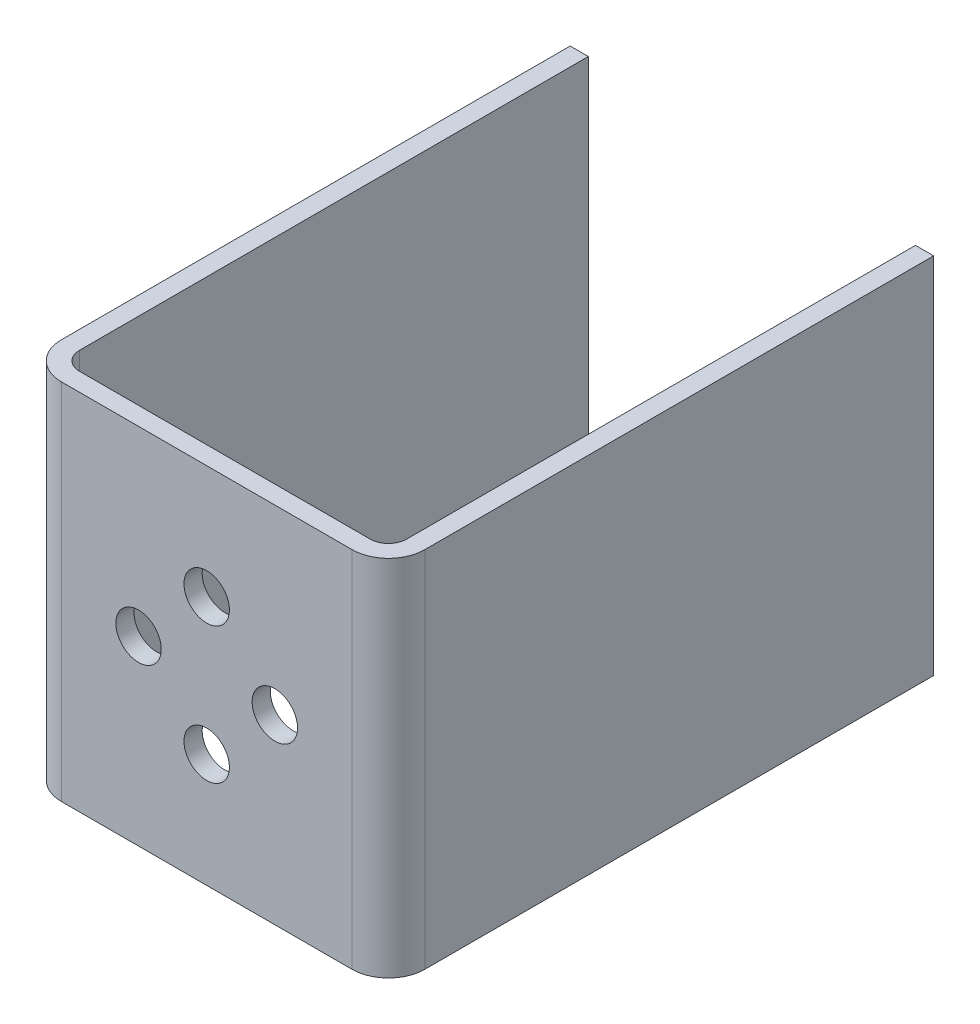
ISO-10303-21;
HEADER;
FILE_DESCRIPTION(('STEP AP214'),'2;1');
FILE_NAME('part.step','',(''),(''),'','','');
FILE_SCHEMA(('AUTOMOTIVE_DESIGN { 1 0 10303 214 1 1 1 1 }'));
ENDSEC;
DATA;
#1=APPLICATION_CONTEXT('core data for automotive mechanical design processes');
#2=APPLICATION_PROTOCOL_DEFINITION('international standard','automotive_design',2000,#1);
#3=PRODUCT_CONTEXT('',#1,'mechanical');
#4=PRODUCT('Part','Part','',(#3));
#5=PRODUCT_RELATED_PRODUCT_CATEGORY('part','',(#4));
#6=PRODUCT_DEFINITION_FORMATION('','',#4);
#7=PRODUCT_DEFINITION_CONTEXT('part definition',#1,'design');
#8=PRODUCT_DEFINITION('design','',#6,#7);
#9=PRODUCT_DEFINITION_SHAPE('','',#8);
#10=(LENGTH_UNIT() NAMED_UNIT(*) SI_UNIT(.MILLI.,.METRE.));
#11=(NAMED_UNIT(*) PLANE_ANGLE_UNIT() SI_UNIT($,.RADIAN.));
#12=(NAMED_UNIT(*) SI_UNIT($,.STERADIAN.) SOLID_ANGLE_UNIT());
#13=UNCERTAINTY_MEASURE_WITH_UNIT(LENGTH_MEASURE(1.E-05),#10,'distance_accuracy_value','');
#14=(GEOMETRIC_REPRESENTATION_CONTEXT(3) GLOBAL_UNCERTAINTY_ASSIGNED_CONTEXT((#13)) GLOBAL_UNIT_ASSIGNED_CONTEXT((#10,
#11,#12)) REPRESENTATION_CONTEXT('',''));
#15=CARTESIAN_POINT('',(0.,0.,0.));
#16=DIRECTION('',(0.,0.,1.));
#17=DIRECTION('',(1.,0.,0.));
#18=AXIS2_PLACEMENT_3D('',#15,#16,#17);
#19=CARTESIAN_POINT('',(48.26,50.8,-76.2));
#20=DIRECTION('',(0.,0.,1.));
#21=DIRECTION('',(1.,0.,0.));
#22=AXIS2_PLACEMENT_3D('',#19,#20,#21);
#23=PLANE('',#22);
#24=DIRECTION('',(-1.,0.,0.));
#25=VECTOR('',#24,1.);
#26=CARTESIAN_POINT('',(48.26,0.,-76.2));
#27=LINE('',#26,#25);
#28=CARTESIAN_POINT('',(50.8,0.,-76.2));
#29=VERTEX_POINT('',#28);
#30=CARTESIAN_POINT('',(48.26,0.,-76.2));
#31=VERTEX_POINT('',#30);
#32=EDGE_CURVE('E161',#29,#31,#27,.T.);
#33=ORIENTED_EDGE('',*,*,#32,.T.);
#34=DIRECTION('',(0.,-1.,0.));
#35=VECTOR('',#34,1.);
#36=CARTESIAN_POINT('',(48.26,50.8,-76.2));
#37=LINE('',#36,#35);
#38=CARTESIAN_POINT('',(48.26,50.8,-76.2));
#39=VERTEX_POINT('',#38);
#40=EDGE_CURVE('E11',#39,#31,#37,.T.);
#41=ORIENTED_EDGE('',*,*,#40,.F.);
#42=DIRECTION('',(-1.,0.,0.));
#43=VECTOR('',#42,1.);
#44=CARTESIAN_POINT('',(48.26,50.8,-76.2));
#45=LINE('',#44,#43);
#46=CARTESIAN_POINT('',(50.8,50.8,-76.2));
#47=VERTEX_POINT('',#46);
#48=EDGE_CURVE('E184',#47,#39,#45,.T.);
#49=ORIENTED_EDGE('',*,*,#48,.F.);
#50=DIRECTION('',(0.,-1.,0.));
#51=VECTOR('',#50,1.);
#52=CARTESIAN_POINT('',(50.8,50.8,-76.2));
#53=LINE('',#52,#51);
#54=EDGE_CURVE('E157',#47,#29,#53,.T.);
#55=ORIENTED_EDGE('',*,*,#54,.T.);
#56=EDGE_LOOP('',(#33,#41,#49,#55));
#57=FACE_BOUND('',#56,.T.);
#58=ADVANCED_FACE('F41',(#57),#23,.F.);
#59=CARTESIAN_POINT('',(48.26,50.8,-5.08));
#60=DIRECTION('',(1.,0.,0.));
#61=DIRECTION('',(0.,0.,-1.));
#62=AXIS2_PLACEMENT_3D('',#59,#60,#61);
#63=PLANE('',#62);
#64=DIRECTION('',(0.,0.,1.));
#65=VECTOR('',#64,1.);
#66=CARTESIAN_POINT('',(48.26,0.,-5.08));
#67=LINE('',#66,#65);
#68=CARTESIAN_POINT('',(48.26,0.,-5.08));
#69=VERTEX_POINT('',#68);
#70=EDGE_CURVE('E164',#31,#69,#67,.T.);
#71=ORIENTED_EDGE('',*,*,#70,.T.);
#72=DIRECTION('',(0.,-1.,0.));
#73=VECTOR('',#72,1.);
#74=CARTESIAN_POINT('',(48.26,50.8,-5.08));
#75=LINE('',#74,#73);
#76=CARTESIAN_POINT('',(48.26,50.8,-5.08));
#77=VERTEX_POINT('',#76);
#78=EDGE_CURVE('E49',#77,#69,#75,.T.);
#79=ORIENTED_EDGE('',*,*,#78,.F.);
#80=DIRECTION('',(0.,0.,1.));
#81=VECTOR('',#80,1.);
#82=CARTESIAN_POINT('',(48.26,50.8,-5.08));
#83=LINE('',#82,#81);
#84=EDGE_CURVE('E112',#39,#77,#83,.T.);
#85=ORIENTED_EDGE('',*,*,#84,.F.);
#86=ORIENTED_EDGE('',*,*,#40,.T.);
#87=EDGE_LOOP('',(#71,#79,#85,#86));
#88=FACE_BOUND('',#87,.T.);
#89=ADVANCED_FACE('F262',(#88),#63,.F.);
#90=CARTESIAN_POINT('',(45.72,50.8,-5.08));
#91=DIRECTION('',(0.,-1.,0.));
#92=DIRECTION('',(0.,0.,-1.));
#93=AXIS2_PLACEMENT_3D('',#90,#91,#92);
#94=CYLINDRICAL_SURFACE('',#93,2.54);
#95=CARTESIAN_POINT('',(45.72,0.,-5.08));
#96=DIRECTION('',(0.,-1.,0.));
#97=DIRECTION('',(0.,0.,1.));
#98=AXIS2_PLACEMENT_3D('',#95,#96,#97);
#99=CIRCLE('',#98,2.54);
#100=CARTESIAN_POINT('',(45.72,0.,-2.54));
#101=VERTEX_POINT('',#100);
#102=EDGE_CURVE('E167',#69,#101,#99,.T.);
#103=ORIENTED_EDGE('',*,*,#102,.T.);
#104=DIRECTION('',(0.,-1.,0.));
#105=VECTOR('',#104,1.);
#106=CARTESIAN_POINT('',(45.72,50.8,-2.54));
#107=LINE('',#106,#105);
#108=CARTESIAN_POINT('',(45.72,50.8,-2.54));
#109=VERTEX_POINT('',#108);
#110=EDGE_CURVE('E203',#109,#101,#107,.T.);
#111=ORIENTED_EDGE('',*,*,#110,.F.);
#112=CARTESIAN_POINT('',(45.72,50.8,-5.08));
#113=DIRECTION('',(0.,-1.,0.));
#114=DIRECTION('',(0.,0.,1.));
#115=AXIS2_PLACEMENT_3D('',#112,#113,#114);
#116=CIRCLE('',#115,2.54);
#117=EDGE_CURVE('E211',#77,#109,#116,.T.);
#118=ORIENTED_EDGE('',*,*,#117,.F.);
#119=ORIENTED_EDGE('',*,*,#78,.T.);
#120=EDGE_LOOP('',(#103,#111,#118,#119));
#121=FACE_BOUND('',#120,.T.);
#122=ADVANCED_FACE('F209',(#121),#94,.F.);
#123=CARTESIAN_POINT('',(5.08000000000001,50.8,-2.54));
#124=DIRECTION('',(0.,0.,1.));
#125=DIRECTION('',(1.,0.,0.));
#126=AXIS2_PLACEMENT_3D('',#123,#124,#125);
#127=PLANE('',#126);
#128=CARTESIAN_POINT('',(34.925,25.4,-2.54));
#129=DIRECTION('',(0.,0.,-1.));
#130=DIRECTION('',(-1.,0.,0.));
#131=AXIS2_PLACEMENT_3D('',#128,#129,#130);
#132=CIRCLE('',#131,3.175);
#133=CARTESIAN_POINT('',(31.75,25.4,-2.54));
#134=VERTEX_POINT('',#133);
#135=EDGE_CURVE('E322',#134,#134,#132,.T.);
#136=ORIENTED_EDGE('',*,*,#135,.F.);
#137=EDGE_LOOP('',(#136));
#138=FACE_BOUND('',#137,.T.);
#139=CARTESIAN_POINT('',(25.4,34.925,-2.54));
#140=DIRECTION('',(0.,0.,-1.));
#141=DIRECTION('',(-1.,0.,0.));
#142=AXIS2_PLACEMENT_3D('',#139,#140,#141);
#143=CIRCLE('',#142,3.17499999999999);
#144=CARTESIAN_POINT('',(22.225,34.925,-2.54));
#145=VERTEX_POINT('',#144);
#146=EDGE_CURVE('E319',#145,#145,#143,.T.);
#147=ORIENTED_EDGE('',*,*,#146,.F.);
#148=EDGE_LOOP('',(#147));
#149=FACE_BOUND('',#148,.T.);
#150=CARTESIAN_POINT('',(15.875,25.4,-2.54));
#151=DIRECTION('',(0.,0.,-1.));
#152=DIRECTION('',(-1.,0.,0.));
#153=AXIS2_PLACEMENT_3D('',#150,#151,#152);
#154=CIRCLE('',#153,3.17499999999999);
#155=CARTESIAN_POINT('',(12.7,25.4,-2.54));
#156=VERTEX_POINT('',#155);
#157=EDGE_CURVE('E315',#156,#156,#154,.T.);
#158=ORIENTED_EDGE('',*,*,#157,.F.);
#159=EDGE_LOOP('',(#158));
#160=FACE_BOUND('',#159,.T.);
#161=CARTESIAN_POINT('',(25.4,15.875,-2.54));
#162=DIRECTION('',(0.,0.,-1.));
#163=DIRECTION('',(-1.,0.,0.));
#164=AXIS2_PLACEMENT_3D('',#161,#162,#163);
#165=CIRCLE('',#164,3.175);
#166=CARTESIAN_POINT('',(22.225,15.875,-2.54));
#167=VERTEX_POINT('',#166);
#168=EDGE_CURVE('E307',#167,#167,#165,.T.);
#169=ORIENTED_EDGE('',*,*,#168,.F.);
#170=EDGE_LOOP('',(#169));
#171=FACE_BOUND('',#170,.T.);
#172=DIRECTION('',(-1.,0.,0.));
#173=VECTOR('',#172,1.);
#174=CARTESIAN_POINT('',(5.08000000000001,0.,-2.54));
#175=LINE('',#174,#173);
#176=CARTESIAN_POINT('',(5.08000000000001,0.,-2.54));
#177=VERTEX_POINT('',#176);
#178=EDGE_CURVE('E169',#101,#177,#175,.T.);
#179=ORIENTED_EDGE('',*,*,#178,.T.);
#180=DIRECTION('',(0.,-1.,0.));
#181=VECTOR('',#180,1.);
#182=CARTESIAN_POINT('',(5.08000000000001,50.8,-2.54));
#183=LINE('',#182,#181);
#184=CARTESIAN_POINT('',(5.08000000000001,50.8,-2.54));
#185=VERTEX_POINT('',#184);
#186=EDGE_CURVE('E200',#185,#177,#183,.T.);
#187=ORIENTED_EDGE('',*,*,#186,.F.);
#188=DIRECTION('',(-1.,0.,0.));
#189=VECTOR('',#188,1.);
#190=CARTESIAN_POINT('',(5.08000000000001,50.8,-2.54));
#191=LINE('',#190,#189);
#192=EDGE_CURVE('E229',#109,#185,#191,.T.);
#193=ORIENTED_EDGE('',*,*,#192,.F.);
#194=ORIENTED_EDGE('',*,*,#110,.T.);
#195=EDGE_LOOP('',(#179,#187,#193,#194));
#196=FACE_BOUND('',#195,.T.);
#197=ADVANCED_FACE('F220',(#138,#149,#160,#171,#196),#127,.F.);
#198=CARTESIAN_POINT('',(5.08000000000001,50.8,-5.08));
#199=DIRECTION('',(0.,-1.,0.));
#200=DIRECTION('',(0.,0.,-1.));
#201=AXIS2_PLACEMENT_3D('',#198,#199,#200);
#202=CYLINDRICAL_SURFACE('',#201,2.54);
#203=CARTESIAN_POINT('',(5.08000000000001,0.,-5.08));
#204=DIRECTION('',(0.,-1.,0.));
#205=DIRECTION('',(0.,0.,1.));
#206=AXIS2_PLACEMENT_3D('',#203,#204,#205);
#207=CIRCLE('',#206,2.54);
#208=CARTESIAN_POINT('',(2.54000000000001,0.,-5.08));
#209=VERTEX_POINT('',#208);
#210=EDGE_CURVE('E171',#177,#209,#207,.T.);
#211=ORIENTED_EDGE('',*,*,#210,.T.);
#212=DIRECTION('',(0.,-1.,0.));
#213=VECTOR('',#212,1.);
#214=CARTESIAN_POINT('',(2.54000000000001,50.8,-5.08));
#215=LINE('',#214,#213);
#216=CARTESIAN_POINT('',(2.54000000000001,50.8,-5.08));
#217=VERTEX_POINT('',#216);
#218=EDGE_CURVE('E197',#217,#209,#215,.T.);
#219=ORIENTED_EDGE('',*,*,#218,.F.);
#220=CARTESIAN_POINT('',(5.08000000000001,50.8,-5.08));
#221=DIRECTION('',(0.,-1.,0.));
#222=DIRECTION('',(0.,0.,1.));
#223=AXIS2_PLACEMENT_3D('',#220,#221,#222);
#224=CIRCLE('',#223,2.54);
#225=EDGE_CURVE('E226',#185,#217,#224,.T.);
#226=ORIENTED_EDGE('',*,*,#225,.F.);
#227=ORIENTED_EDGE('',*,*,#186,.T.);
#228=EDGE_LOOP('',(#211,#219,#226,#227));
#229=FACE_BOUND('',#228,.T.);
#230=ADVANCED_FACE('F224',(#229),#202,.F.);
#231=CARTESIAN_POINT('',(2.54,50.8,-76.2));
#232=DIRECTION('',(-1.,0.,0.));
#233=DIRECTION('',(0.,0.,1.));
#234=AXIS2_PLACEMENT_3D('',#231,#232,#233);
#235=PLANE('',#234);
#236=DIRECTION('',(0.,0.,-1.));
#237=VECTOR('',#236,1.);
#238=CARTESIAN_POINT('',(2.54,0.,-76.2));
#239=LINE('',#238,#237);
#240=CARTESIAN_POINT('',(2.54,0.,-76.2));
#241=VERTEX_POINT('',#240);
#242=EDGE_CURVE('E173',#209,#241,#239,.T.);
#243=ORIENTED_EDGE('',*,*,#242,.T.);
#244=DIRECTION('',(0.,-1.,0.));
#245=VECTOR('',#244,1.);
#246=CARTESIAN_POINT('',(2.54,50.8,-76.2));
#247=LINE('',#246,#245);
#248=CARTESIAN_POINT('',(2.54,50.8,-76.2));
#249=VERTEX_POINT('',#248);
#250=EDGE_CURVE('E194',#249,#241,#247,.T.);
#251=ORIENTED_EDGE('',*,*,#250,.F.);
#252=DIRECTION('',(0.,0.,-1.));
#253=VECTOR('',#252,1.);
#254=CARTESIAN_POINT('',(2.54,50.8,-76.2));
#255=LINE('',#254,#253);
#256=EDGE_CURVE('E228',#217,#249,#255,.T.);
#257=ORIENTED_EDGE('',*,*,#256,.F.);
#258=ORIENTED_EDGE('',*,*,#218,.T.);
#259=EDGE_LOOP('',(#243,#251,#257,#258));
#260=FACE_BOUND('',#259,.T.);
#261=ADVANCED_FACE('F276',(#260),#235,.F.);
#262=CARTESIAN_POINT('',(0.,50.8,-76.2));
#263=DIRECTION('',(0.,0.,1.));
#264=DIRECTION('',(1.,0.,0.));
#265=AXIS2_PLACEMENT_3D('',#262,#263,#264);
#266=PLANE('',#265);
#267=DIRECTION('',(-1.,0.,0.));
#268=VECTOR('',#267,1.);
#269=CARTESIAN_POINT('',(0.,0.,-76.2));
#270=LINE('',#269,#268);
#271=CARTESIAN_POINT('',(0.,0.,-76.2));
#272=VERTEX_POINT('',#271);
#273=EDGE_CURVE('E175',#241,#272,#270,.T.);
#274=ORIENTED_EDGE('',*,*,#273,.T.);
#275=DIRECTION('',(0.,-1.,0.));
#276=VECTOR('',#275,1.);
#277=CARTESIAN_POINT('',(0.,50.8,-76.2));
#278=LINE('',#277,#276);
#279=CARTESIAN_POINT('',(0.,50.8,-76.2));
#280=VERTEX_POINT('',#279);
#281=EDGE_CURVE('E191',#280,#272,#278,.T.);
#282=ORIENTED_EDGE('',*,*,#281,.F.);
#283=DIRECTION('',(-1.,0.,0.));
#284=VECTOR('',#283,1.);
#285=CARTESIAN_POINT('',(0.,50.8,-76.2));
#286=LINE('',#285,#284);
#287=EDGE_CURVE('E231',#249,#280,#286,.T.);
#288=ORIENTED_EDGE('',*,*,#287,.F.);
#289=ORIENTED_EDGE('',*,*,#250,.T.);
#290=EDGE_LOOP('',(#274,#282,#288,#289));
#291=FACE_BOUND('',#290,.T.);
#292=ADVANCED_FACE('F279',(#291),#266,.F.);
#293=CARTESIAN_POINT('',(0.,50.8,-5.08000000000004));
#294=DIRECTION('',(1.,0.,0.));
#295=DIRECTION('',(0.,0.,-1.));
#296=AXIS2_PLACEMENT_3D('',#293,#294,#295);
#297=PLANE('',#296);
#298=DIRECTION('',(0.,0.,1.));
#299=VECTOR('',#298,1.);
#300=CARTESIAN_POINT('',(0.,0.,-5.08000000000004));
#301=LINE('',#300,#299);
#302=CARTESIAN_POINT('',(0.,0.,-5.08000000000003));
#303=VERTEX_POINT('',#302);
#304=EDGE_CURVE('E177',#272,#303,#301,.T.);
#305=ORIENTED_EDGE('',*,*,#304,.T.);
#306=DIRECTION('',(0.,-1.,0.));
#307=VECTOR('',#306,1.);
#308=CARTESIAN_POINT('',(0.,50.8,-5.08000000000003));
#309=LINE('',#308,#307);
#310=CARTESIAN_POINT('',(0.,50.8,-5.08000000000003));
#311=VERTEX_POINT('',#310);
#312=EDGE_CURVE('E188',#311,#303,#309,.T.);
#313=ORIENTED_EDGE('',*,*,#312,.F.);
#314=DIRECTION('',(0.,0.,1.));
#315=VECTOR('',#314,1.);
#316=CARTESIAN_POINT('',(0.,50.8,-5.08000000000004));
#317=LINE('',#316,#315);
#318=EDGE_CURVE('E237',#280,#311,#317,.T.);
#319=ORIENTED_EDGE('',*,*,#318,.F.);
#320=ORIENTED_EDGE('',*,*,#281,.T.);
#321=EDGE_LOOP('',(#305,#313,#319,#320));
#322=FACE_BOUND('',#321,.T.);
#323=ADVANCED_FACE('F243',(#322),#297,.F.);
#324=CARTESIAN_POINT('',(5.08,50.8,-5.08));
#325=DIRECTION('',(0.,-1.,0.));
#326=DIRECTION('',(0.,0.,-1.));
#327=AXIS2_PLACEMENT_3D('',#324,#325,#326);
#328=CYLINDRICAL_SURFACE('',#327,5.08);
#329=CARTESIAN_POINT('',(5.08,0.,-5.08));
#330=DIRECTION('',(0.,1.,0.));
#331=DIRECTION('',(0.,0.,-1.));
#332=AXIS2_PLACEMENT_3D('',#329,#330,#331);
#333=CIRCLE('',#332,5.08);
#334=CARTESIAN_POINT('',(5.08000000000004,0.,0.));
#335=VERTEX_POINT('',#334);
#336=EDGE_CURVE('E179',#303,#335,#333,.T.);
#337=ORIENTED_EDGE('',*,*,#336,.T.);
#338=DIRECTION('',(0.,-1.,0.));
#339=VECTOR('',#338,1.);
#340=CARTESIAN_POINT('',(5.08000000000004,50.8,0.));
#341=LINE('',#340,#339);
#342=CARTESIAN_POINT('',(5.08000000000004,50.8,0.));
#343=VERTEX_POINT('',#342);
#344=EDGE_CURVE('E152',#343,#335,#341,.T.);
#345=ORIENTED_EDGE('',*,*,#344,.F.);
#346=CARTESIAN_POINT('',(5.08,50.8,-5.08));
#347=DIRECTION('',(0.,1.,0.));
#348=DIRECTION('',(0.,0.,-1.));
#349=AXIS2_PLACEMENT_3D('',#346,#347,#348);
#350=CIRCLE('',#349,5.08);
#351=EDGE_CURVE('E143',#311,#343,#350,.T.);
#352=ORIENTED_EDGE('',*,*,#351,.F.);
#353=ORIENTED_EDGE('',*,*,#312,.T.);
#354=EDGE_LOOP('',(#337,#345,#352,#353));
#355=FACE_BOUND('',#354,.T.);
#356=ADVANCED_FACE('F247',(#355),#328,.T.);
#357=CARTESIAN_POINT('',(5.08000000000004,50.8,0.));
#358=DIRECTION('',(0.,0.,-1.));
#359=DIRECTION('',(-1.,0.,0.));
#360=AXIS2_PLACEMENT_3D('',#357,#358,#359);
#361=PLANE('',#360);
#362=CARTESIAN_POINT('',(34.925,25.4,0.));
#363=DIRECTION('',(0.,0.,-1.));
#364=DIRECTION('',(-1.,0.,0.));
#365=AXIS2_PLACEMENT_3D('',#362,#363,#364);
#366=CIRCLE('',#365,3.175);
#367=CARTESIAN_POINT('',(31.75,25.4,0.));
#368=VERTEX_POINT('',#367);
#369=EDGE_CURVE('E165',#368,#368,#366,.T.);
#370=ORIENTED_EDGE('',*,*,#369,.T.);
#371=EDGE_LOOP('',(#370));
#372=FACE_BOUND('',#371,.T.);
#373=CARTESIAN_POINT('',(25.4,34.925,0.));
#374=DIRECTION('',(0.,0.,-1.));
#375=DIRECTION('',(-1.,0.,0.));
#376=AXIS2_PLACEMENT_3D('',#373,#374,#375);
#377=CIRCLE('',#376,3.17499999999999);
#378=CARTESIAN_POINT('',(22.225,34.925,0.));
#379=VERTEX_POINT('',#378);
#380=EDGE_CURVE('E298',#379,#379,#377,.T.);
#381=ORIENTED_EDGE('',*,*,#380,.T.);
#382=EDGE_LOOP('',(#381));
#383=FACE_BOUND('',#382,.T.);
#384=CARTESIAN_POINT('',(15.875,25.4,0.));
#385=DIRECTION('',(0.,0.,-1.));
#386=DIRECTION('',(-1.,0.,0.));
#387=AXIS2_PLACEMENT_3D('',#384,#385,#386);
#388=CIRCLE('',#387,3.17499999999999);
#389=CARTESIAN_POINT('',(12.7,25.4,0.));
#390=VERTEX_POINT('',#389);
#391=EDGE_CURVE('E302',#390,#390,#388,.T.);
#392=ORIENTED_EDGE('',*,*,#391,.T.);
#393=EDGE_LOOP('',(#392));
#394=FACE_BOUND('',#393,.T.);
#395=CARTESIAN_POINT('',(25.4,15.875,0.));
#396=DIRECTION('',(0.,0.,-1.));
#397=DIRECTION('',(-1.,0.,0.));
#398=AXIS2_PLACEMENT_3D('',#395,#396,#397);
#399=CIRCLE('',#398,3.175);
#400=CARTESIAN_POINT('',(22.225,15.875,0.));
#401=VERTEX_POINT('',#400);
#402=EDGE_CURVE('E305',#401,#401,#399,.T.);
#403=ORIENTED_EDGE('',*,*,#402,.T.);
#404=EDGE_LOOP('',(#403));
#405=FACE_BOUND('',#404,.T.);
#406=DIRECTION('',(1.,0.,0.));
#407=VECTOR('',#406,1.);
#408=CARTESIAN_POINT('',(5.08000000000004,0.,0.));
#409=LINE('',#408,#407);
#410=CARTESIAN_POINT('',(45.72,0.,0.));
#411=VERTEX_POINT('',#410);
#412=EDGE_CURVE('E151',#335,#411,#409,.T.);
#413=ORIENTED_EDGE('',*,*,#412,.T.);
#414=DIRECTION('',(0.,-1.,0.));
#415=VECTOR('',#414,1.);
#416=CARTESIAN_POINT('',(45.72,50.8,0.));
#417=LINE('',#416,#415);
#418=CARTESIAN_POINT('',(45.72,50.8,0.));
#419=VERTEX_POINT('',#418);
#420=EDGE_CURVE('E148',#419,#411,#417,.T.);
#421=ORIENTED_EDGE('',*,*,#420,.F.);
#422=DIRECTION('',(1.,0.,0.));
#423=VECTOR('',#422,1.);
#424=CARTESIAN_POINT('',(5.08000000000004,50.8,0.));
#425=LINE('',#424,#423);
#426=EDGE_CURVE('E137',#343,#419,#425,.T.);
#427=ORIENTED_EDGE('',*,*,#426,.F.);
#428=ORIENTED_EDGE('',*,*,#344,.T.);
#429=EDGE_LOOP('',(#413,#421,#427,#428));
#430=FACE_BOUND('',#429,.T.);
#431=ADVANCED_FACE('F149',(#372,#383,#394,#405,#430),#361,.F.);
#432=CARTESIAN_POINT('',(45.72,50.8,-5.08));
#433=DIRECTION('',(0.,-1.,0.));
#434=DIRECTION('',(0.,0.,-1.));
#435=AXIS2_PLACEMENT_3D('',#432,#433,#434);
#436=CYLINDRICAL_SURFACE('',#435,5.08);
#437=CARTESIAN_POINT('',(45.72,0.,-5.08));
#438=DIRECTION('',(0.,1.,0.));
#439=DIRECTION('',(0.,0.,1.));
#440=AXIS2_PLACEMENT_3D('',#437,#438,#439);
#441=CIRCLE('',#440,5.08);
#442=CARTESIAN_POINT('',(50.8,0.,-5.08));
#443=VERTEX_POINT('',#442);
#444=EDGE_CURVE('E98',#411,#443,#441,.T.);
#445=ORIENTED_EDGE('',*,*,#444,.T.);
#446=DIRECTION('',(0.,-1.,0.));
#447=VECTOR('',#446,1.);
#448=CARTESIAN_POINT('',(50.8,50.8,-5.08));
#449=LINE('',#448,#447);
#450=CARTESIAN_POINT('',(50.8,50.8,-5.08));
#451=VERTEX_POINT('',#450);
#452=EDGE_CURVE('E153',#451,#443,#449,.T.);
#453=ORIENTED_EDGE('',*,*,#452,.F.);
#454=CARTESIAN_POINT('',(45.72,50.8,-5.08));
#455=DIRECTION('',(0.,1.,0.));
#456=DIRECTION('',(0.,0.,1.));
#457=AXIS2_PLACEMENT_3D('',#454,#455,#456);
#458=CIRCLE('',#457,5.08);
#459=EDGE_CURVE('E141',#419,#451,#458,.T.);
#460=ORIENTED_EDGE('',*,*,#459,.F.);
#461=ORIENTED_EDGE('',*,*,#420,.T.);
#462=EDGE_LOOP('',(#445,#453,#460,#461));
#463=FACE_BOUND('',#462,.T.);
#464=ADVANCED_FACE('F155',(#463),#436,.T.);
#465=CARTESIAN_POINT('',(50.8,50.8,-5.08));
#466=DIRECTION('',(-1.,0.,0.));
#467=DIRECTION('',(0.,0.,1.));
#468=AXIS2_PLACEMENT_3D('',#465,#466,#467);
#469=PLANE('',#468);
#470=DIRECTION('',(0.,0.,-1.));
#471=VECTOR('',#470,1.);
#472=CARTESIAN_POINT('',(50.8,0.,-5.08));
#473=LINE('',#472,#471);
#474=EDGE_CURVE('E104',#443,#29,#473,.T.);
#475=ORIENTED_EDGE('',*,*,#474,.T.);
#476=ORIENTED_EDGE('',*,*,#54,.F.);
#477=DIRECTION('',(0.,0.,-1.));
#478=VECTOR('',#477,1.);
#479=CARTESIAN_POINT('',(50.8,50.8,-5.08));
#480=LINE('',#479,#478);
#481=EDGE_CURVE('E57',#451,#47,#480,.T.);
#482=ORIENTED_EDGE('',*,*,#481,.F.);
#483=ORIENTED_EDGE('',*,*,#452,.T.);
#484=EDGE_LOOP('',(#475,#476,#482,#483));
#485=FACE_BOUND('',#484,.T.);
#486=ADVANCED_FACE('F251',(#485),#469,.F.);
#487=CARTESIAN_POINT('',(45.72,50.8,-5.08));
#488=DIRECTION('',(0.,1.,0.));
#489=DIRECTION('',(0.,0.,1.));
#490=AXIS2_PLACEMENT_3D('',#487,#488,#489);
#491=PLANE('',#490);
#492=ORIENTED_EDGE('',*,*,#48,.T.);
#493=ORIENTED_EDGE('',*,*,#84,.T.);
#494=ORIENTED_EDGE('',*,*,#117,.T.);
#495=ORIENTED_EDGE('',*,*,#192,.T.);
#496=ORIENTED_EDGE('',*,*,#225,.T.);
#497=ORIENTED_EDGE('',*,*,#256,.T.);
#498=ORIENTED_EDGE('',*,*,#287,.T.);
#499=ORIENTED_EDGE('',*,*,#318,.T.);
#500=ORIENTED_EDGE('',*,*,#351,.T.);
#501=ORIENTED_EDGE('',*,*,#426,.T.);
#502=ORIENTED_EDGE('',*,*,#459,.T.);
#503=ORIENTED_EDGE('',*,*,#481,.T.);
#504=EDGE_LOOP('',(#492,#493,#494,#495,#496,#497,#498,#499,#500,#501,#502,#503));
#505=FACE_BOUND('',#504,.T.);
#506=ADVANCED_FACE('F139',(#505),#491,.T.);
#507=CARTESIAN_POINT('',(45.72,0.,-5.08));
#508=DIRECTION('',(0.,1.,0.));
#509=DIRECTION('',(0.,0.,1.));
#510=AXIS2_PLACEMENT_3D('',#507,#508,#509);
#511=PLANE('',#510);
#512=ORIENTED_EDGE('',*,*,#32,.F.);
#513=ORIENTED_EDGE('',*,*,#474,.F.);
#514=ORIENTED_EDGE('',*,*,#444,.F.);
#515=ORIENTED_EDGE('',*,*,#412,.F.);
#516=ORIENTED_EDGE('',*,*,#336,.F.);
#517=ORIENTED_EDGE('',*,*,#304,.F.);
#518=ORIENTED_EDGE('',*,*,#273,.F.);
#519=ORIENTED_EDGE('',*,*,#242,.F.);
#520=ORIENTED_EDGE('',*,*,#210,.F.);
#521=ORIENTED_EDGE('',*,*,#178,.F.);
#522=ORIENTED_EDGE('',*,*,#102,.F.);
#523=ORIENTED_EDGE('',*,*,#70,.F.);
#524=EDGE_LOOP('',(#512,#513,#514,#515,#516,#517,#518,#519,#520,#521,#522,#523));
#525=FACE_BOUND('',#524,.T.);
#526=ADVANCED_FACE('F215',(#525),#511,.F.);
#527=CARTESIAN_POINT('',(25.4,15.875,0.));
#528=DIRECTION('',(0.,0.,-1.));
#529=DIRECTION('',(-1.,0.,0.));
#530=AXIS2_PLACEMENT_3D('',#527,#528,#529);
#531=CYLINDRICAL_SURFACE('',#530,3.175);
#532=ORIENTED_EDGE('',*,*,#402,.F.);
#533=EDGE_LOOP('',(#532));
#534=FACE_BOUND('',#533,.T.);
#535=ORIENTED_EDGE('',*,*,#168,.T.);
#536=EDGE_LOOP('',(#535));
#537=FACE_BOUND('',#536,.T.);
#538=ADVANCED_FACE('F335',(#534,#537),#531,.F.);
#539=CARTESIAN_POINT('',(15.875,25.4,0.));
#540=DIRECTION('',(0.,0.,-1.));
#541=DIRECTION('',(-1.,0.,0.));
#542=AXIS2_PLACEMENT_3D('',#539,#540,#541);
#543=CYLINDRICAL_SURFACE('',#542,3.17499999999999);
#544=ORIENTED_EDGE('',*,*,#391,.F.);
#545=EDGE_LOOP('',(#544));
#546=FACE_BOUND('',#545,.T.);
#547=ORIENTED_EDGE('',*,*,#157,.T.);
#548=EDGE_LOOP('',(#547));
#549=FACE_BOUND('',#548,.T.);
#550=ADVANCED_FACE('F337',(#546,#549),#543,.F.);
#551=CARTESIAN_POINT('',(25.4,34.925,0.));
#552=DIRECTION('',(0.,0.,-1.));
#553=DIRECTION('',(-1.,0.,0.));
#554=AXIS2_PLACEMENT_3D('',#551,#552,#553);
#555=CYLINDRICAL_SURFACE('',#554,3.17499999999999);
#556=ORIENTED_EDGE('',*,*,#380,.F.);
#557=EDGE_LOOP('',(#556));
#558=FACE_BOUND('',#557,.T.);
#559=ORIENTED_EDGE('',*,*,#146,.T.);
#560=EDGE_LOOP('',(#559));
#561=FACE_BOUND('',#560,.T.);
#562=ADVANCED_FACE('F343',(#558,#561),#555,.F.);
#563=CARTESIAN_POINT('',(34.925,25.4,0.));
#564=DIRECTION('',(0.,0.,-1.));
#565=DIRECTION('',(-1.,0.,0.));
#566=AXIS2_PLACEMENT_3D('',#563,#564,#565);
#567=CYLINDRICAL_SURFACE('',#566,3.175);
#568=ORIENTED_EDGE('',*,*,#369,.F.);
#569=EDGE_LOOP('',(#568));
#570=FACE_BOUND('',#569,.T.);
#571=ORIENTED_EDGE('',*,*,#135,.T.);
#572=EDGE_LOOP('',(#571));
#573=FACE_BOUND('',#572,.T.);
#574=ADVANCED_FACE('F327',(#570,#573),#567,.F.);
#575=CLOSED_SHELL('',(#58,#89,#122,#197,#230,#261,#292,#323,#356,#431,#464,#486,#506,#526,#538,
#550,#562,#574));
#576=MANIFOLD_SOLID_BREP('B2',#575);
#577=ADVANCED_BREP_SHAPE_REPRESENTATION('',(#18,#576),#14);
#578=SHAPE_DEFINITION_REPRESENTATION(#9,#577);
ENDSEC;
END-ISO-10303-21;
